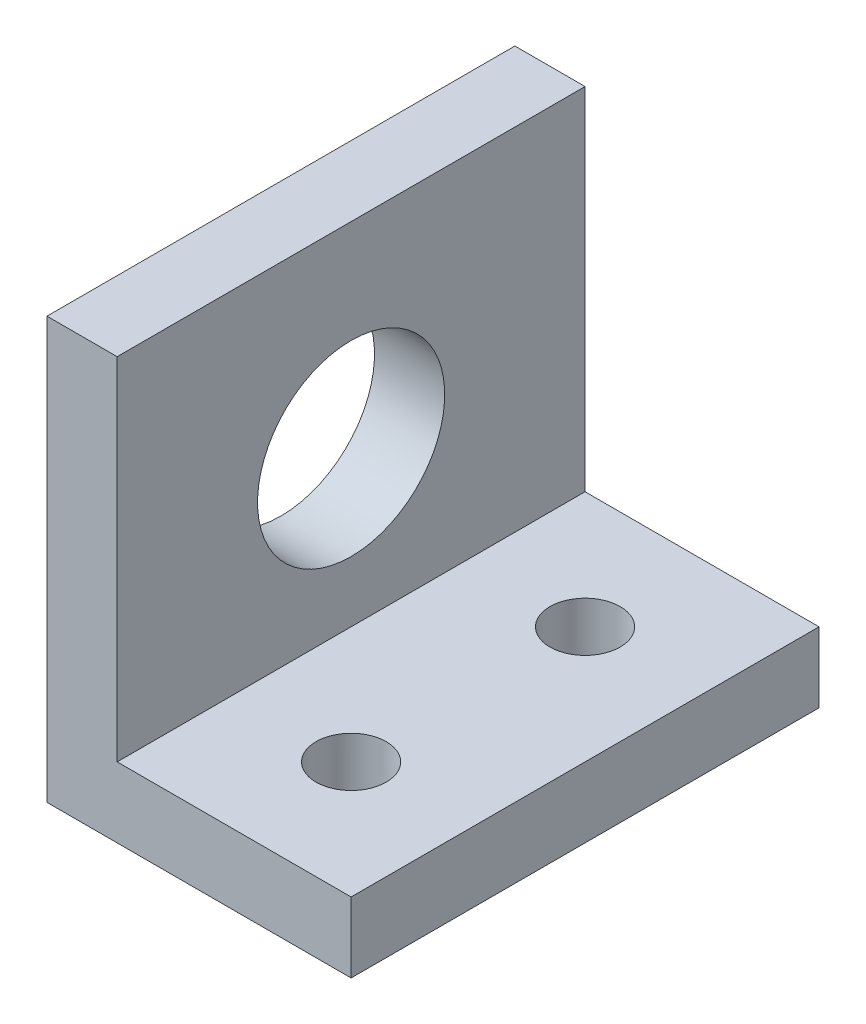
ISO-10303-21;
HEADER;
FILE_DESCRIPTION(('STEP AP214'),'2;1');
FILE_NAME('part.step','',(''),(''),'','','');
FILE_SCHEMA(('AUTOMOTIVE_DESIGN { 1 0 10303 214 1 1 1 1 }'));
ENDSEC;
DATA;
#1=APPLICATION_CONTEXT('core data for automotive mechanical design processes');
#2=APPLICATION_PROTOCOL_DEFINITION('international standard','automotive_design',2000,#1);
#3=PRODUCT_CONTEXT('',#1,'mechanical');
#4=PRODUCT('Part','Part','',(#3));
#5=PRODUCT_RELATED_PRODUCT_CATEGORY('part','',(#4));
#6=PRODUCT_DEFINITION_FORMATION('','',#4);
#7=PRODUCT_DEFINITION_CONTEXT('part definition',#1,'design');
#8=PRODUCT_DEFINITION('design','',#6,#7);
#9=PRODUCT_DEFINITION_SHAPE('','',#8);
#10=(LENGTH_UNIT() NAMED_UNIT(*) SI_UNIT(.MILLI.,.METRE.));
#11=(NAMED_UNIT(*) PLANE_ANGLE_UNIT() SI_UNIT($,.RADIAN.));
#12=(NAMED_UNIT(*) SI_UNIT($,.STERADIAN.) SOLID_ANGLE_UNIT());
#13=UNCERTAINTY_MEASURE_WITH_UNIT(LENGTH_MEASURE(1.E-05),#10,'distance_accuracy_value','');
#14=(GEOMETRIC_REPRESENTATION_CONTEXT(3) GLOBAL_UNCERTAINTY_ASSIGNED_CONTEXT((#13)) GLOBAL_UNIT_ASSIGNED_CONTEXT((#10,
#11,#12)) REPRESENTATION_CONTEXT('',''));
#15=CARTESIAN_POINT('',(0.,0.,0.));
#16=DIRECTION('',(0.,0.,1.));
#17=DIRECTION('',(1.,0.,0.));
#18=AXIS2_PLACEMENT_3D('',#15,#16,#17);
#19=CARTESIAN_POINT('',(0.,18.,20.));
#20=DIRECTION('',(1.,0.,0.));
#21=DIRECTION('',(0.,1.,0.));
#22=AXIS2_PLACEMENT_3D('',#19,#20,#21);
#23=PLANE('',#22);
#24=CARTESIAN_POINT('',(0.,9.6,10.));
#25=DIRECTION('',(1.,0.,0.));
#26=DIRECTION('',(0.,1.,0.));
#27=AXIS2_PLACEMENT_3D('',#24,#25,#26);
#28=CIRCLE('',#27,4.);
#29=CARTESIAN_POINT('',(0.,13.6,10.));
#30=VERTEX_POINT('',#29);
#31=EDGE_CURVE('E143',#30,#30,#28,.T.);
#32=ORIENTED_EDGE('',*,*,#31,.T.);
#33=EDGE_LOOP('',(#32));
#34=FACE_BOUND('',#33,.T.);
#35=DIRECTION('',(0.,-1.,0.));
#36=VECTOR('',#35,1.);
#37=CARTESIAN_POINT('',(0.,18.,0.));
#38=LINE('',#37,#36);
#39=CARTESIAN_POINT('',(0.,18.,0.));
#40=VERTEX_POINT('',#39);
#41=CARTESIAN_POINT('',(0.,0.,0.));
#42=VERTEX_POINT('',#41);
#43=EDGE_CURVE('E125',#40,#42,#38,.T.);
#44=ORIENTED_EDGE('',*,*,#43,.T.);
#45=DIRECTION('',(0.,0.,-1.));
#46=VECTOR('',#45,1.);
#47=CARTESIAN_POINT('',(0.,0.,20.));
#48=LINE('',#47,#46);
#49=CARTESIAN_POINT('',(0.,0.,20.));
#50=VERTEX_POINT('',#49);
#51=EDGE_CURVE('E11',#50,#42,#48,.T.);
#52=ORIENTED_EDGE('',*,*,#51,.F.);
#53=DIRECTION('',(0.,-1.,0.));
#54=VECTOR('',#53,1.);
#55=CARTESIAN_POINT('',(0.,18.,20.));
#56=LINE('',#55,#54);
#57=CARTESIAN_POINT('',(0.,18.,20.));
#58=VERTEX_POINT('',#57);
#59=EDGE_CURVE('E136',#58,#50,#56,.T.);
#60=ORIENTED_EDGE('',*,*,#59,.F.);
#61=DIRECTION('',(0.,0.,-1.));
#62=VECTOR('',#61,1.);
#63=CARTESIAN_POINT('',(0.,18.,20.));
#64=LINE('',#63,#62);
#65=EDGE_CURVE('E121',#58,#40,#64,.T.);
#66=ORIENTED_EDGE('',*,*,#65,.T.);
#67=EDGE_LOOP('',(#44,#52,#60,#66));
#68=FACE_BOUND('',#67,.T.);
#69=ADVANCED_FACE('F39',(#34,#68),#23,.F.);
#70=CARTESIAN_POINT('',(0.,0.,20.));
#71=DIRECTION('',(0.,1.,0.));
#72=DIRECTION('',(0.,0.,1.));
#73=AXIS2_PLACEMENT_3D('',#70,#71,#72);
#74=PLANE('',#73);
#75=CARTESIAN_POINT('',(8.,0.,5.));
#76=DIRECTION('',(0.,1.,0.));
#77=DIRECTION('',(-1.,0.,0.));
#78=AXIS2_PLACEMENT_3D('',#75,#76,#77);
#79=CIRCLE('',#78,1.5);
#80=CARTESIAN_POINT('',(6.5,0.,5.));
#81=VERTEX_POINT('',#80);
#82=EDGE_CURVE('E146',#81,#81,#79,.T.);
#83=ORIENTED_EDGE('',*,*,#82,.T.);
#84=EDGE_LOOP('',(#83));
#85=FACE_BOUND('',#84,.T.);
#86=CARTESIAN_POINT('',(8.,0.,15.));
#87=DIRECTION('',(0.,1.,0.));
#88=DIRECTION('',(-1.,0.,0.));
#89=AXIS2_PLACEMENT_3D('',#86,#87,#88);
#90=CIRCLE('',#89,1.5);
#91=CARTESIAN_POINT('',(6.5,0.,15.));
#92=VERTEX_POINT('',#91);
#93=EDGE_CURVE('E151',#92,#92,#90,.T.);
#94=ORIENTED_EDGE('',*,*,#93,.T.);
#95=EDGE_LOOP('',(#94));
#96=FACE_BOUND('',#95,.T.);
#97=DIRECTION('',(1.,0.,0.));
#98=VECTOR('',#97,1.);
#99=CARTESIAN_POINT('',(0.,0.,0.));
#100=LINE('',#99,#98);
#101=CARTESIAN_POINT('',(13.,0.,0.));
#102=VERTEX_POINT('',#101);
#103=EDGE_CURVE('E128',#42,#102,#100,.T.);
#104=ORIENTED_EDGE('',*,*,#103,.T.);
#105=DIRECTION('',(0.,0.,-1.));
#106=VECTOR('',#105,1.);
#107=CARTESIAN_POINT('',(13.,0.,20.));
#108=LINE('',#107,#106);
#109=CARTESIAN_POINT('',(13.,0.,20.));
#110=VERTEX_POINT('',#109);
#111=EDGE_CURVE('E48',#110,#102,#108,.T.);
#112=ORIENTED_EDGE('',*,*,#111,.F.);
#113=DIRECTION('',(1.,0.,0.));
#114=VECTOR('',#113,1.);
#115=CARTESIAN_POINT('',(0.,0.,20.));
#116=LINE('',#115,#114);
#117=EDGE_CURVE('E94',#50,#110,#116,.T.);
#118=ORIENTED_EDGE('',*,*,#117,.F.);
#119=ORIENTED_EDGE('',*,*,#51,.T.);
#120=EDGE_LOOP('',(#104,#112,#118,#119));
#121=FACE_BOUND('',#120,.T.);
#122=ADVANCED_FACE('F163',(#85,#96,#121),#74,.F.);
#123=CARTESIAN_POINT('',(13.,0.,20.));
#124=DIRECTION('',(-1.,0.,0.));
#125=DIRECTION('',(0.,-1.,0.));
#126=AXIS2_PLACEMENT_3D('',#123,#124,#125);
#127=PLANE('',#126);
#128=DIRECTION('',(0.,1.,0.));
#129=VECTOR('',#128,1.);
#130=CARTESIAN_POINT('',(13.,0.,0.));
#131=LINE('',#130,#129);
#132=CARTESIAN_POINT('',(13.,3.,0.));
#133=VERTEX_POINT('',#132);
#134=EDGE_CURVE('E131',#102,#133,#131,.T.);
#135=ORIENTED_EDGE('',*,*,#134,.T.);
#136=DIRECTION('',(0.,0.,-1.));
#137=VECTOR('',#136,1.);
#138=CARTESIAN_POINT('',(13.,3.,20.));
#139=LINE('',#138,#137);
#140=CARTESIAN_POINT('',(13.,3.,20.));
#141=VERTEX_POINT('',#140);
#142=EDGE_CURVE('E116',#141,#133,#139,.T.);
#143=ORIENTED_EDGE('',*,*,#142,.F.);
#144=DIRECTION('',(0.,1.,0.));
#145=VECTOR('',#144,1.);
#146=CARTESIAN_POINT('',(13.,0.,20.));
#147=LINE('',#146,#145);
#148=EDGE_CURVE('E107',#110,#141,#147,.T.);
#149=ORIENTED_EDGE('',*,*,#148,.F.);
#150=ORIENTED_EDGE('',*,*,#111,.T.);
#151=EDGE_LOOP('',(#135,#143,#149,#150));
#152=FACE_BOUND('',#151,.T.);
#153=ADVANCED_FACE('F166',(#152),#127,.F.);
#154=CARTESIAN_POINT('',(13.,3.,20.));
#155=DIRECTION('',(0.,-1.,0.));
#156=DIRECTION('',(1.,0.,0.));
#157=AXIS2_PLACEMENT_3D('',#154,#155,#156);
#158=PLANE('',#157);
#159=CARTESIAN_POINT('',(8.,3.,5.));
#160=DIRECTION('',(0.,-1.,0.));
#161=DIRECTION('',(1.,0.,0.));
#162=AXIS2_PLACEMENT_3D('',#159,#160,#161);
#163=CIRCLE('',#162,1.5);
#164=CARTESIAN_POINT('',(9.5,3.,5.));
#165=VERTEX_POINT('',#164);
#166=EDGE_CURVE('E42',#165,#165,#163,.T.);
#167=ORIENTED_EDGE('',*,*,#166,.T.);
#168=EDGE_LOOP('',(#167));
#169=FACE_BOUND('',#168,.T.);
#170=CARTESIAN_POINT('',(8.,3.,15.));
#171=DIRECTION('',(0.,-1.,0.));
#172=DIRECTION('',(1.,0.,0.));
#173=AXIS2_PLACEMENT_3D('',#170,#171,#172);
#174=CIRCLE('',#173,1.5);
#175=CARTESIAN_POINT('',(9.5,3.,15.));
#176=VERTEX_POINT('',#175);
#177=EDGE_CURVE('E144',#176,#176,#174,.T.);
#178=ORIENTED_EDGE('',*,*,#177,.T.);
#179=EDGE_LOOP('',(#178));
#180=FACE_BOUND('',#179,.T.);
#181=DIRECTION('',(-1.,0.,0.));
#182=VECTOR('',#181,1.);
#183=CARTESIAN_POINT('',(13.,3.,0.));
#184=LINE('',#183,#182);
#185=CARTESIAN_POINT('',(3.,3.,0.));
#186=VERTEX_POINT('',#185);
#187=EDGE_CURVE('E115',#133,#186,#184,.T.);
#188=ORIENTED_EDGE('',*,*,#187,.T.);
#189=DIRECTION('',(0.,0.,-1.));
#190=VECTOR('',#189,1.);
#191=CARTESIAN_POINT('',(3.,3.,20.));
#192=LINE('',#191,#190);
#193=CARTESIAN_POINT('',(3.,3.,20.));
#194=VERTEX_POINT('',#193);
#195=EDGE_CURVE('E112',#194,#186,#192,.T.);
#196=ORIENTED_EDGE('',*,*,#195,.F.);
#197=DIRECTION('',(-1.,0.,0.));
#198=VECTOR('',#197,1.);
#199=CARTESIAN_POINT('',(13.,3.,20.));
#200=LINE('',#199,#198);
#201=EDGE_CURVE('E101',#141,#194,#200,.T.);
#202=ORIENTED_EDGE('',*,*,#201,.F.);
#203=ORIENTED_EDGE('',*,*,#142,.T.);
#204=EDGE_LOOP('',(#188,#196,#202,#203));
#205=FACE_BOUND('',#204,.T.);
#206=ADVANCED_FACE('F113',(#169,#180,#205),#158,.F.);
#207=CARTESIAN_POINT('',(3.,3.,20.));
#208=DIRECTION('',(-1.,0.,0.));
#209=DIRECTION('',(0.,-1.,0.));
#210=AXIS2_PLACEMENT_3D('',#207,#208,#209);
#211=PLANE('',#210);
#212=CARTESIAN_POINT('',(3.,9.6,10.));
#213=DIRECTION('',(-1.,0.,0.));
#214=DIRECTION('',(0.,-1.,0.));
#215=AXIS2_PLACEMENT_3D('',#212,#213,#214);
#216=CIRCLE('',#215,4.);
#217=CARTESIAN_POINT('',(3.,13.6,10.));
#218=VERTEX_POINT('',#217);
#219=EDGE_CURVE('E129',#218,#218,#216,.T.);
#220=ORIENTED_EDGE('',*,*,#219,.T.);
#221=EDGE_LOOP('',(#220));
#222=FACE_BOUND('',#221,.T.);
#223=DIRECTION('',(0.,1.,0.));
#224=VECTOR('',#223,1.);
#225=CARTESIAN_POINT('',(3.,3.,0.));
#226=LINE('',#225,#224);
#227=CARTESIAN_POINT('',(3.,18.,0.));
#228=VERTEX_POINT('',#227);
#229=EDGE_CURVE('E80',#186,#228,#226,.T.);
#230=ORIENTED_EDGE('',*,*,#229,.T.);
#231=DIRECTION('',(0.,0.,-1.));
#232=VECTOR('',#231,1.);
#233=CARTESIAN_POINT('',(3.,18.,20.));
#234=LINE('',#233,#232);
#235=CARTESIAN_POINT('',(3.,18.,20.));
#236=VERTEX_POINT('',#235);
#237=EDGE_CURVE('E117',#236,#228,#234,.T.);
#238=ORIENTED_EDGE('',*,*,#237,.F.);
#239=DIRECTION('',(0.,1.,0.));
#240=VECTOR('',#239,1.);
#241=CARTESIAN_POINT('',(3.,3.,20.));
#242=LINE('',#241,#240);
#243=EDGE_CURVE('E105',#194,#236,#242,.T.);
#244=ORIENTED_EDGE('',*,*,#243,.F.);
#245=ORIENTED_EDGE('',*,*,#195,.T.);
#246=EDGE_LOOP('',(#230,#238,#244,#245));
#247=FACE_BOUND('',#246,.T.);
#248=ADVANCED_FACE('F119',(#222,#247),#211,.F.);
#249=CARTESIAN_POINT('',(3.,18.,20.));
#250=DIRECTION('',(0.,-1.,0.));
#251=DIRECTION('',(0.,0.,-1.));
#252=AXIS2_PLACEMENT_3D('',#249,#250,#251);
#253=PLANE('',#252);
#254=DIRECTION('',(-1.,0.,0.));
#255=VECTOR('',#254,1.);
#256=CARTESIAN_POINT('',(3.,18.,0.));
#257=LINE('',#256,#255);
#258=EDGE_CURVE('E86',#228,#40,#257,.T.);
#259=ORIENTED_EDGE('',*,*,#258,.T.);
#260=ORIENTED_EDGE('',*,*,#65,.F.);
#261=DIRECTION('',(-1.,0.,0.));
#262=VECTOR('',#261,1.);
#263=CARTESIAN_POINT('',(3.,18.,20.));
#264=LINE('',#263,#262);
#265=EDGE_CURVE('E57',#236,#58,#264,.T.);
#266=ORIENTED_EDGE('',*,*,#265,.F.);
#267=ORIENTED_EDGE('',*,*,#237,.T.);
#268=EDGE_LOOP('',(#259,#260,#266,#267));
#269=FACE_BOUND('',#268,.T.);
#270=ADVANCED_FACE('F171',(#269),#253,.F.);
#271=CARTESIAN_POINT('',(0.,0.,20.));
#272=DIRECTION('',(0.,0.,1.));
#273=DIRECTION('',(1.,0.,0.));
#274=AXIS2_PLACEMENT_3D('',#271,#272,#273);
#275=PLANE('',#274);
#276=ORIENTED_EDGE('',*,*,#59,.T.);
#277=ORIENTED_EDGE('',*,*,#117,.T.);
#278=ORIENTED_EDGE('',*,*,#148,.T.);
#279=ORIENTED_EDGE('',*,*,#201,.T.);
#280=ORIENTED_EDGE('',*,*,#243,.T.);
#281=ORIENTED_EDGE('',*,*,#265,.T.);
#282=EDGE_LOOP('',(#276,#277,#278,#279,#280,#281));
#283=FACE_BOUND('',#282,.T.);
#284=ADVANCED_FACE('F103',(#283),#275,.T.);
#285=CARTESIAN_POINT('',(0.,0.,0.));
#286=DIRECTION('',(0.,0.,1.));
#287=DIRECTION('',(1.,0.,0.));
#288=AXIS2_PLACEMENT_3D('',#285,#286,#287);
#289=PLANE('',#288);
#290=ORIENTED_EDGE('',*,*,#43,.F.);
#291=ORIENTED_EDGE('',*,*,#258,.F.);
#292=ORIENTED_EDGE('',*,*,#229,.F.);
#293=ORIENTED_EDGE('',*,*,#187,.F.);
#294=ORIENTED_EDGE('',*,*,#134,.F.);
#295=ORIENTED_EDGE('',*,*,#103,.F.);
#296=EDGE_LOOP('',(#290,#291,#292,#293,#294,#295));
#297=FACE_BOUND('',#296,.T.);
#298=ADVANCED_FACE('F169',(#297),#289,.F.);
#299=CARTESIAN_POINT('',(0.,9.6,10.));
#300=DIRECTION('',(1.,0.,0.));
#301=DIRECTION('',(0.,1.,0.));
#302=AXIS2_PLACEMENT_3D('',#299,#300,#301);
#303=CYLINDRICAL_SURFACE('',#302,4.);
#304=CARTESIAN_POINT('',(0.,13.6,10.));
#305=CARTESIAN_POINT('',(0.0312499999999991,13.6,10.));
#306=CARTESIAN_POINT('',(0.062499999999999,13.6,10.));
#307=CARTESIAN_POINT('',(0.124999999999999,13.6,10.));
#308=CARTESIAN_POINT('',(0.156249999999999,13.6,10.));
#309=CARTESIAN_POINT('',(0.218749999999999,13.6,10.));
#310=CARTESIAN_POINT('',(0.249999999999999,13.6,10.));
#311=CARTESIAN_POINT('',(0.312499999999999,13.6,10.));
#312=CARTESIAN_POINT('',(0.343749999999999,13.6,10.));
#313=CARTESIAN_POINT('',(0.406249999999999,13.6,10.));
#314=CARTESIAN_POINT('',(0.437499999999999,13.6,10.));
#315=CARTESIAN_POINT('',(0.499999999999999,13.6,10.));
#316=CARTESIAN_POINT('',(0.531249999999999,13.6,10.));
#317=CARTESIAN_POINT('',(0.593749999999999,13.6,10.));
#318=CARTESIAN_POINT('',(0.624999999999999,13.6,10.));
#319=CARTESIAN_POINT('',(0.687499999999999,13.6,10.));
#320=CARTESIAN_POINT('',(0.718749999999999,13.6,10.));
#321=CARTESIAN_POINT('',(0.781249999999999,13.6,10.));
#322=CARTESIAN_POINT('',(0.812499999999999,13.6,10.));
#323=CARTESIAN_POINT('',(0.874999999999999,13.6,10.));
#324=CARTESIAN_POINT('',(0.906249999999999,13.6,10.));
#325=CARTESIAN_POINT('',(0.968749999999999,13.6,10.));
#326=CARTESIAN_POINT('',(0.999999999999999,13.6,10.));
#327=CARTESIAN_POINT('',(1.0625,13.6,10.));
#328=CARTESIAN_POINT('',(1.09375,13.6,10.));
#329=CARTESIAN_POINT('',(1.15625,13.6,10.));
#330=CARTESIAN_POINT('',(1.1875,13.6,10.));
#331=CARTESIAN_POINT('',(1.25,13.6,10.));
#332=CARTESIAN_POINT('',(1.28125,13.6,10.));
#333=CARTESIAN_POINT('',(1.34375,13.6,10.));
#334=CARTESIAN_POINT('',(1.375,13.6,10.));
#335=CARTESIAN_POINT('',(1.4375,13.6,10.));
#336=CARTESIAN_POINT('',(1.46875,13.6,10.));
#337=CARTESIAN_POINT('',(1.53125,13.6,10.));
#338=CARTESIAN_POINT('',(1.5625,13.6,10.));
#339=CARTESIAN_POINT('',(1.625,13.6,10.));
#340=CARTESIAN_POINT('',(1.65625,13.6,10.));
#341=CARTESIAN_POINT('',(1.71875,13.6,10.));
#342=CARTESIAN_POINT('',(1.75,13.6,10.));
#343=CARTESIAN_POINT('',(1.8125,13.6,10.));
#344=CARTESIAN_POINT('',(1.84375,13.6,10.));
#345=CARTESIAN_POINT('',(1.90625,13.6,10.));
#346=CARTESIAN_POINT('',(1.9375,13.6,10.));
#347=CARTESIAN_POINT('',(2.,13.6,10.));
#348=CARTESIAN_POINT('',(2.03125,13.6,10.));
#349=CARTESIAN_POINT('',(2.09375,13.6,10.));
#350=CARTESIAN_POINT('',(2.125,13.6,10.));
#351=CARTESIAN_POINT('',(2.1875,13.6,10.));
#352=CARTESIAN_POINT('',(2.21875,13.6,10.));
#353=CARTESIAN_POINT('',(2.28125,13.6,10.));
#354=CARTESIAN_POINT('',(2.3125,13.6,10.));
#355=CARTESIAN_POINT('',(2.375,13.6,10.));
#356=CARTESIAN_POINT('',(2.40625,13.6,10.));
#357=CARTESIAN_POINT('',(2.46875,13.6,10.));
#358=CARTESIAN_POINT('',(2.5,13.6,10.));
#359=CARTESIAN_POINT('',(2.5625,13.6,10.));
#360=CARTESIAN_POINT('',(2.59375,13.6,10.));
#361=CARTESIAN_POINT('',(2.65625,13.6,10.));
#362=CARTESIAN_POINT('',(2.6875,13.6,10.));
#363=CARTESIAN_POINT('',(2.75,13.6,10.));
#364=CARTESIAN_POINT('',(2.78125,13.6,10.));
#365=CARTESIAN_POINT('',(2.84375,13.6,10.));
#366=CARTESIAN_POINT('',(2.875,13.6,10.));
#367=CARTESIAN_POINT('',(2.9375,13.6,10.));
#368=CARTESIAN_POINT('',(2.96875,13.6,10.));
#369=CARTESIAN_POINT('',(3.,13.6,10.));
#370=B_SPLINE_CURVE_WITH_KNOTS('',3,(#304,#305,#306,#307,#308,#309,#310,#311,#312,#313,#314,
#315,#316,#317,#318,#319,#320,#321,#322,#323,#324,#325,#326,#327,#328,#329,#330,#331,#332,#333,
#334,#335,#336,#337,#338,#339,#340,#341,#342,#343,#344,#345,#346,#347,#348,#349,#350,#351,#352,
#353,#354,#355,#356,#357,#358,#359,#360,#361,#362,#363,#364,#365,#366,#367,#368,#369),
.UNSPECIFIED.,.F.,.F.,(4,2,2,2,2,2,2,2,2,2,2,2,2,2,2,2,2,2,2,2,2,2,2,2,2,2,2,2,2,2,2,2,4),(0.,
0.09375,0.1875,0.28125,0.375,0.46875,0.5625,0.65625,0.75,0.84375,0.9375,1.03125,1.125,1.21875,
1.3125,1.40625,1.5,1.59375,1.6875,1.78125,1.875,1.96875,2.0625,2.15625,2.25,2.34375,2.4375,
2.53125,2.625,2.71875,2.8125,2.90625,3.),.UNSPECIFIED.);
#371=EDGE_CURVE('BSEAM191',#30,#218,#370,.T.);
#372=ORIENTED_EDGE('',*,*,#31,.F.);
#373=ORIENTED_EDGE('',*,*,#219,.F.);
#374=ORIENTED_EDGE('',*,*,#371,.T.);
#375=ORIENTED_EDGE('',*,*,#371,.F.);
#376=EDGE_LOOP('',(#372,#374,#373,#375));
#377=FACE_BOUND('',#376,.T.);
#378=ADVANCED_FACE('F191',(#377),#303,.F.);
#379=CARTESIAN_POINT('',(8.,0.,15.));
#380=DIRECTION('',(0.,1.,0.));
#381=DIRECTION('',(-1.,0.,0.));
#382=AXIS2_PLACEMENT_3D('',#379,#380,#381);
#383=CYLINDRICAL_SURFACE('',#382,1.5);
#384=ORIENTED_EDGE('',*,*,#93,.F.);
#385=EDGE_LOOP('',(#384));
#386=FACE_BOUND('',#385,.T.);
#387=ORIENTED_EDGE('',*,*,#177,.F.);
#388=EDGE_LOOP('',(#387));
#389=FACE_BOUND('',#388,.T.);
#390=ADVANCED_FACE('F194',(#386,#389),#383,.F.);
#391=CARTESIAN_POINT('',(8.,0.,5.));
#392=DIRECTION('',(0.,1.,0.));
#393=DIRECTION('',(-1.,0.,0.));
#394=AXIS2_PLACEMENT_3D('',#391,#392,#393);
#395=CYLINDRICAL_SURFACE('',#394,1.5);
#396=ORIENTED_EDGE('',*,*,#82,.F.);
#397=EDGE_LOOP('',(#396));
#398=FACE_BOUND('',#397,.T.);
#399=ORIENTED_EDGE('',*,*,#166,.F.);
#400=EDGE_LOOP('',(#399));
#401=FACE_BOUND('',#400,.T.);
#402=ADVANCED_FACE('F200',(#398,#401),#395,.F.);
#403=CLOSED_SHELL('',(#69,#122,#153,#206,#248,#270,#284,#298,#378,#390,#402));
#404=MANIFOLD_SOLID_BREP('B2',#403);
#405=ADVANCED_BREP_SHAPE_REPRESENTATION('',(#18,#404),#14);
#406=SHAPE_DEFINITION_REPRESENTATION(#9,#405);
ENDSEC;
END-ISO-10303-21;
